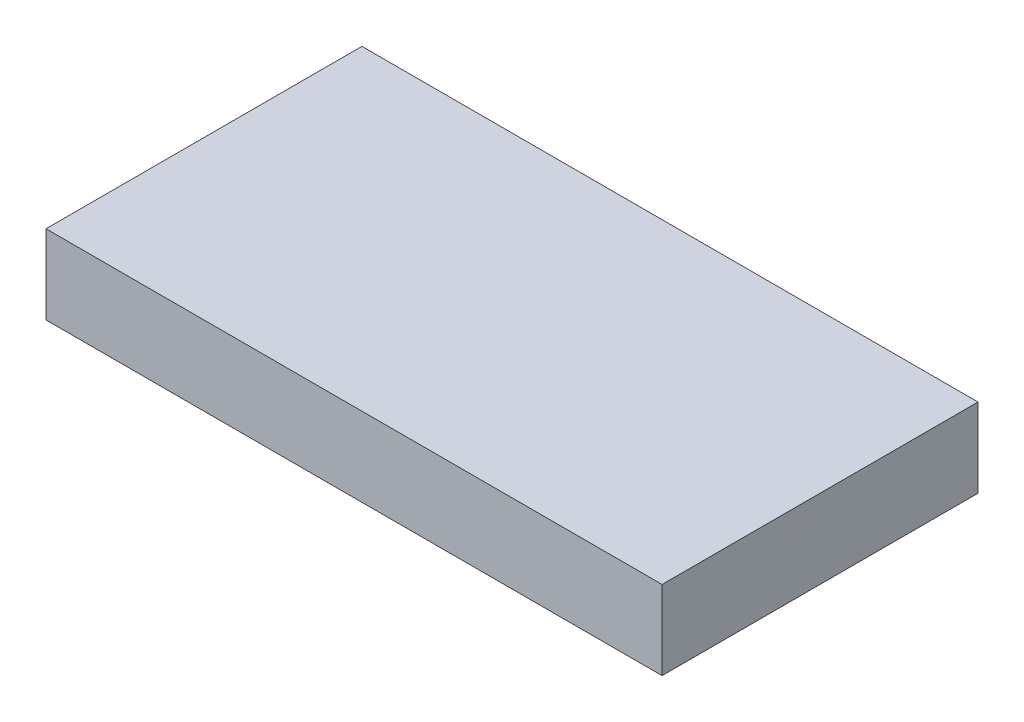
ISO-10303-21;
HEADER;
FILE_DESCRIPTION(('STEP AP214'),'2;1');
FILE_NAME('part.step','',(''),(''),'','','');
FILE_SCHEMA(('AUTOMOTIVE_DESIGN { 1 0 10303 214 1 1 1 1 }'));
ENDSEC;
DATA;
#1=APPLICATION_CONTEXT('core data for automotive mechanical design processes');
#2=APPLICATION_PROTOCOL_DEFINITION('international standard','automotive_design',2000,#1);
#3=PRODUCT_CONTEXT('',#1,'mechanical');
#4=PRODUCT('Part','Part','',(#3));
#5=PRODUCT_RELATED_PRODUCT_CATEGORY('part','',(#4));
#6=PRODUCT_DEFINITION_FORMATION('','',#4);
#7=PRODUCT_DEFINITION_CONTEXT('part definition',#1,'design');
#8=PRODUCT_DEFINITION('design','',#6,#7);
#9=PRODUCT_DEFINITION_SHAPE('','',#8);
#10=(LENGTH_UNIT() NAMED_UNIT(*) SI_UNIT(.MILLI.,.METRE.));
#11=(NAMED_UNIT(*) PLANE_ANGLE_UNIT() SI_UNIT($,.RADIAN.));
#12=(NAMED_UNIT(*) SI_UNIT($,.STERADIAN.) SOLID_ANGLE_UNIT());
#13=UNCERTAINTY_MEASURE_WITH_UNIT(LENGTH_MEASURE(1.E-05),#10,'distance_accuracy_value','');
#14=(GEOMETRIC_REPRESENTATION_CONTEXT(3) GLOBAL_UNCERTAINTY_ASSIGNED_CONTEXT((#13)) GLOBAL_UNIT_ASSIGNED_CONTEXT((#10,
#11,#12)) REPRESENTATION_CONTEXT('',''));
#15=CARTESIAN_POINT('',(0.,0.,0.));
#16=DIRECTION('',(0.,0.,1.));
#17=DIRECTION('',(1.,0.,0.));
#18=AXIS2_PLACEMENT_3D('',#15,#16,#17);
#19=CARTESIAN_POINT('',(0.,0.,20.));
#20=DIRECTION('',(1.,0.,0.));
#21=DIRECTION('',(0.,0.,-1.));
#22=AXIS2_PLACEMENT_3D('',#19,#20,#21);
#23=PLANE('',#22);
#24=DIRECTION('',(0.,-1.,0.));
#25=VECTOR('',#24,1.);
#26=CARTESIAN_POINT('',(0.,0.,0.));
#27=LINE('',#26,#25);
#28=CARTESIAN_POINT('',(0.,5.,0.));
#29=VERTEX_POINT('',#28);
#30=CARTESIAN_POINT('',(0.,0.,0.));
#31=VERTEX_POINT('',#30);
#32=EDGE_CURVE('E105',#29,#31,#27,.T.);
#33=ORIENTED_EDGE('',*,*,#32,.T.);
#34=DIRECTION('',(0.,0.,-1.));
#35=VECTOR('',#34,1.);
#36=CARTESIAN_POINT('',(0.,0.,20.));
#37=LINE('',#36,#35);
#38=CARTESIAN_POINT('',(0.,0.,20.));
#39=VERTEX_POINT('',#38);
#40=EDGE_CURVE('E11',#39,#31,#37,.T.);
#41=ORIENTED_EDGE('',*,*,#40,.F.);
#42=DIRECTION('',(0.,-1.,0.));
#43=VECTOR('',#42,1.);
#44=CARTESIAN_POINT('',(0.,0.,20.));
#45=LINE('',#44,#43);
#46=CARTESIAN_POINT('',(0.,5.,20.));
#47=VERTEX_POINT('',#46);
#48=EDGE_CURVE('E89',#47,#39,#45,.T.);
#49=ORIENTED_EDGE('',*,*,#48,.F.);
#50=DIRECTION('',(0.,0.,-1.));
#51=VECTOR('',#50,1.);
#52=CARTESIAN_POINT('',(0.,5.,20.));
#53=LINE('',#52,#51);
#54=EDGE_CURVE('E97',#47,#29,#53,.T.);
#55=ORIENTED_EDGE('',*,*,#54,.T.);
#56=EDGE_LOOP('',(#33,#41,#49,#55));
#57=FACE_BOUND('',#56,.T.);
#58=ADVANCED_FACE('F39',(#57),#23,.F.);
#59=CARTESIAN_POINT('',(0.,0.,20.));
#60=DIRECTION('',(0.,1.,0.));
#61=DIRECTION('',(0.,0.,1.));
#62=AXIS2_PLACEMENT_3D('',#59,#60,#61);
#63=PLANE('',#62);
#64=DIRECTION('',(1.,0.,0.));
#65=VECTOR('',#64,1.);
#66=CARTESIAN_POINT('',(0.,0.,0.));
#67=LINE('',#66,#65);
#68=CARTESIAN_POINT('',(39.,0.,0.));
#69=VERTEX_POINT('',#68);
#70=EDGE_CURVE('E92',#31,#69,#67,.T.);
#71=ORIENTED_EDGE('',*,*,#70,.T.);
#72=DIRECTION('',(0.,0.,-1.));
#73=VECTOR('',#72,1.);
#74=CARTESIAN_POINT('',(39.,0.,20.));
#75=LINE('',#74,#73);
#76=CARTESIAN_POINT('',(39.,0.,20.));
#77=VERTEX_POINT('',#76);
#78=EDGE_CURVE('E50',#77,#69,#75,.T.);
#79=ORIENTED_EDGE('',*,*,#78,.F.);
#80=DIRECTION('',(1.,0.,0.));
#81=VECTOR('',#80,1.);
#82=CARTESIAN_POINT('',(0.,0.,20.));
#83=LINE('',#82,#81);
#84=EDGE_CURVE('E82',#39,#77,#83,.T.);
#85=ORIENTED_EDGE('',*,*,#84,.F.);
#86=ORIENTED_EDGE('',*,*,#40,.T.);
#87=EDGE_LOOP('',(#71,#79,#85,#86));
#88=FACE_BOUND('',#87,.T.);
#89=ADVANCED_FACE('F93',(#88),#63,.F.);
#90=CARTESIAN_POINT('',(39.,0.,20.));
#91=DIRECTION('',(-1.,0.,0.));
#92=DIRECTION('',(0.,0.,1.));
#93=AXIS2_PLACEMENT_3D('',#90,#91,#92);
#94=PLANE('',#93);
#95=DIRECTION('',(0.,1.,0.));
#96=VECTOR('',#95,1.);
#97=CARTESIAN_POINT('',(39.,0.,0.));
#98=LINE('',#97,#96);
#99=CARTESIAN_POINT('',(39.,5.,0.));
#100=VERTEX_POINT('',#99);
#101=EDGE_CURVE('E72',#69,#100,#98,.T.);
#102=ORIENTED_EDGE('',*,*,#101,.T.);
#103=DIRECTION('',(0.,0.,-1.));
#104=VECTOR('',#103,1.);
#105=CARTESIAN_POINT('',(39.,5.,20.));
#106=LINE('',#105,#104);
#107=CARTESIAN_POINT('',(39.,5.,20.));
#108=VERTEX_POINT('',#107);
#109=EDGE_CURVE('E94',#108,#100,#106,.T.);
#110=ORIENTED_EDGE('',*,*,#109,.F.);
#111=DIRECTION('',(0.,1.,0.));
#112=VECTOR('',#111,1.);
#113=CARTESIAN_POINT('',(39.,0.,20.));
#114=LINE('',#113,#112);
#115=EDGE_CURVE('E88',#77,#108,#114,.T.);
#116=ORIENTED_EDGE('',*,*,#115,.F.);
#117=ORIENTED_EDGE('',*,*,#78,.T.);
#118=EDGE_LOOP('',(#102,#110,#116,#117));
#119=FACE_BOUND('',#118,.T.);
#120=ADVANCED_FACE('F96',(#119),#94,.F.);
#121=CARTESIAN_POINT('',(0.,5.,20.));
#122=DIRECTION('',(0.,-1.,0.));
#123=DIRECTION('',(0.,0.,-1.));
#124=AXIS2_PLACEMENT_3D('',#121,#122,#123);
#125=PLANE('',#124);
#126=DIRECTION('',(-1.,0.,0.));
#127=VECTOR('',#126,1.);
#128=CARTESIAN_POINT('',(0.,5.,0.));
#129=LINE('',#128,#127);
#130=EDGE_CURVE('E76',#100,#29,#129,.T.);
#131=ORIENTED_EDGE('',*,*,#130,.T.);
#132=ORIENTED_EDGE('',*,*,#54,.F.);
#133=DIRECTION('',(-1.,0.,0.));
#134=VECTOR('',#133,1.);
#135=CARTESIAN_POINT('',(0.,5.,20.));
#136=LINE('',#135,#134);
#137=EDGE_CURVE('E54',#108,#47,#136,.T.);
#138=ORIENTED_EDGE('',*,*,#137,.F.);
#139=ORIENTED_EDGE('',*,*,#109,.T.);
#140=EDGE_LOOP('',(#131,#132,#138,#139));
#141=FACE_BOUND('',#140,.T.);
#142=ADVANCED_FACE('F108',(#141),#125,.F.);
#143=CARTESIAN_POINT('',(0.,0.,20.));
#144=DIRECTION('',(0.,0.,-1.));
#145=DIRECTION('',(-1.,0.,0.));
#146=AXIS2_PLACEMENT_3D('',#143,#144,#145);
#147=PLANE('',#146);
#148=ORIENTED_EDGE('',*,*,#48,.T.);
#149=ORIENTED_EDGE('',*,*,#84,.T.);
#150=ORIENTED_EDGE('',*,*,#115,.T.);
#151=ORIENTED_EDGE('',*,*,#137,.T.);
#152=EDGE_LOOP('',(#148,#149,#150,#151));
#153=FACE_BOUND('',#152,.T.);
#154=ADVANCED_FACE('F86',(#153),#147,.F.);
#155=CARTESIAN_POINT('',(0.,0.,0.));
#156=DIRECTION('',(0.,0.,-1.));
#157=DIRECTION('',(-1.,0.,0.));
#158=AXIS2_PLACEMENT_3D('',#155,#156,#157);
#159=PLANE('',#158);
#160=ORIENTED_EDGE('',*,*,#32,.F.);
#161=ORIENTED_EDGE('',*,*,#130,.F.);
#162=ORIENTED_EDGE('',*,*,#101,.F.);
#163=ORIENTED_EDGE('',*,*,#70,.F.);
#164=EDGE_LOOP('',(#160,#161,#162,#163));
#165=FACE_BOUND('',#164,.T.);
#166=ADVANCED_FACE('F115',(#165),#159,.T.);
#167=CLOSED_SHELL('',(#58,#89,#120,#142,#154,#166));
#168=MANIFOLD_SOLID_BREP('B2',#167);
#169=ADVANCED_BREP_SHAPE_REPRESENTATION('',(#18,#168),#14);
#170=SHAPE_DEFINITION_REPRESENTATION(#9,#169);
ENDSEC;
END-ISO-10303-21;
